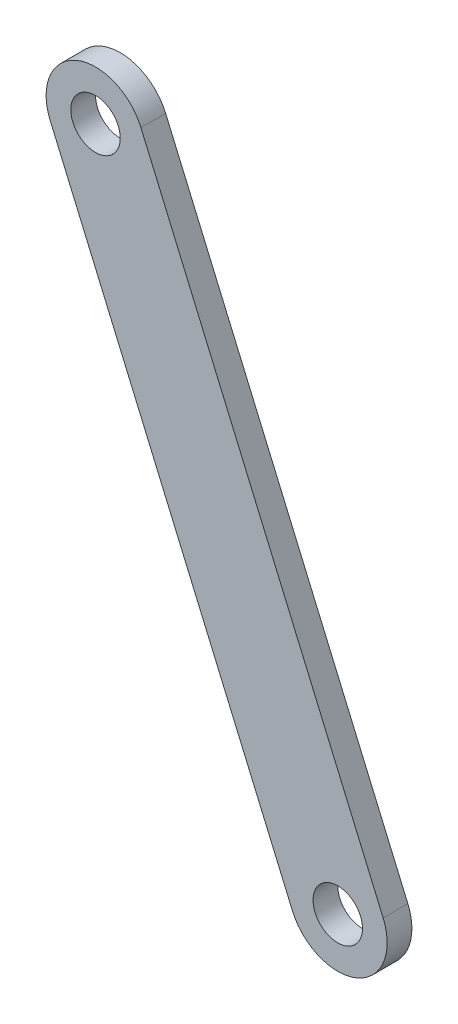
ISO-10303-21;
HEADER;
FILE_DESCRIPTION(('STEP AP214'),'2;1');
FILE_NAME('part.step','',(''),(''),'','','');
FILE_SCHEMA(('AUTOMOTIVE_DESIGN { 1 0 10303 214 1 1 1 1 }'));
ENDSEC;
DATA;
#1=APPLICATION_CONTEXT('core data for automotive mechanical design processes');
#2=APPLICATION_PROTOCOL_DEFINITION('international standard','automotive_design',2000,#1);
#3=PRODUCT_CONTEXT('',#1,'mechanical');
#4=PRODUCT('Part','Part','',(#3));
#5=PRODUCT_RELATED_PRODUCT_CATEGORY('part','',(#4));
#6=PRODUCT_DEFINITION_FORMATION('','',#4);
#7=PRODUCT_DEFINITION_CONTEXT('part definition',#1,'design');
#8=PRODUCT_DEFINITION('design','',#6,#7);
#9=PRODUCT_DEFINITION_SHAPE('','',#8);
#10=(LENGTH_UNIT() NAMED_UNIT(*) SI_UNIT(.MILLI.,.METRE.));
#11=(NAMED_UNIT(*) PLANE_ANGLE_UNIT() SI_UNIT($,.RADIAN.));
#12=(NAMED_UNIT(*) SI_UNIT($,.STERADIAN.) SOLID_ANGLE_UNIT());
#13=UNCERTAINTY_MEASURE_WITH_UNIT(LENGTH_MEASURE(1.E-05),#10,'distance_accuracy_value','');
#14=(GEOMETRIC_REPRESENTATION_CONTEXT(3) GLOBAL_UNCERTAINTY_ASSIGNED_CONTEXT((#13)) GLOBAL_UNIT_ASSIGNED_CONTEXT((#10,
#11,#12)) REPRESENTATION_CONTEXT('',''));
#15=CARTESIAN_POINT('',(0.,0.,0.));
#16=DIRECTION('',(0.,0.,1.));
#17=DIRECTION('',(1.,0.,0.));
#18=AXIS2_PLACEMENT_3D('',#15,#16,#17);
#19=CARTESIAN_POINT('',(-74.7943653809361,8.1431702058961,1.5875));
#20=DIRECTION('',(0.,0.,1.));
#21=DIRECTION('',(1.,0.,0.));
#22=AXIS2_PLACEMENT_3D('',#19,#20,#21);
#23=PLANE('',#22);
#24=CARTESIAN_POINT('',(-59.231514961415,-28.0529302307478,1.5875));
#25=DIRECTION('',(0.,0.,1.));
#26=DIRECTION('',(1.,0.,0.));
#27=AXIS2_PLACEMENT_3D('',#24,#25,#26);
#28=CIRCLE('',#27,1.5875);
#29=CARTESIAN_POINT('',(-57.644014961415,-28.0529302307478,1.5875));
#30=VERTEX_POINT('',#29);
#31=EDGE_CURVE('E101',#30,#30,#28,.T.);
#32=ORIENTED_EDGE('',*,*,#31,.F.);
#33=EDGE_LOOP('',(#32));
#34=FACE_BOUND('',#33,.T.);
#35=CARTESIAN_POINT('',(-74.7943653809361,8.1431702058961,1.5875));
#36=DIRECTION('',(0.,0.,1.));
#37=DIRECTION('',(1.,0.,0.));
#38=AXIS2_PLACEMENT_3D('',#35,#36,#37);
#39=CIRCLE('',#38,3.17500000000001);
#40=CARTESIAN_POINT('',(-71.877547642704,9.39728315213923,1.5875));
#41=VERTEX_POINT('',#40);
#42=CARTESIAN_POINT('',(-77.7111831191682,6.88905725965296,1.5875));
#43=VERTEX_POINT('',#42);
#44=EDGE_CURVE('E86',#41,#43,#39,.T.);
#45=ORIENTED_EDGE('',*,*,#44,.T.);
#46=DIRECTION('',(0.394996203541145,-0.918682752199083,0.));
#47=VECTOR('',#46,1.);
#48=CARTESIAN_POINT('',(-77.7111831191682,6.88905725965296,1.5875));
#49=LINE('',#48,#47);
#50=CARTESIAN_POINT('',(-62.148332699647,-29.3070431769909,1.5875));
#51=VERTEX_POINT('',#50);
#52=EDGE_CURVE('E81',#43,#51,#49,.T.);
#53=ORIENTED_EDGE('',*,*,#52,.T.);
#54=CARTESIAN_POINT('',(-59.231514961415,-28.0529302307478,1.5875));
#55=DIRECTION('',(0.,0.,1.));
#56=DIRECTION('',(1.,0.,0.));
#57=AXIS2_PLACEMENT_3D('',#54,#55,#56);
#58=CIRCLE('',#57,3.17499999999999);
#59=CARTESIAN_POINT('',(-56.3146972231829,-26.7988172845047,1.5875));
#60=VERTEX_POINT('',#59);
#61=EDGE_CURVE('E84',#51,#60,#58,.T.);
#62=ORIENTED_EDGE('',*,*,#61,.T.);
#63=DIRECTION('',(-0.394996203541144,0.918682752199084,0.));
#64=VECTOR('',#63,1.);
#65=CARTESIAN_POINT('',(-71.877547642704,9.39728315213923,1.5875));
#66=LINE('',#65,#64);
#67=EDGE_CURVE('E51',#60,#41,#66,.T.);
#68=ORIENTED_EDGE('',*,*,#67,.T.);
#69=EDGE_LOOP('',(#45,#53,#62,#68));
#70=FACE_BOUND('',#69,.T.);
#71=CARTESIAN_POINT('',(-74.7943653809361,8.1431702058961,1.5875));
#72=DIRECTION('',(0.,0.,1.));
#73=DIRECTION('',(1.,0.,0.));
#74=AXIS2_PLACEMENT_3D('',#71,#72,#73);
#75=CIRCLE('',#74,1.5875);
#76=CARTESIAN_POINT('',(-73.2068653809361,8.1431702058961,1.5875));
#77=VERTEX_POINT('',#76);
#78=EDGE_CURVE('E116',#77,#77,#75,.T.);
#79=ORIENTED_EDGE('',*,*,#78,.F.);
#80=EDGE_LOOP('',(#79));
#81=FACE_BOUND('',#80,.T.);
#82=ADVANCED_FACE('F34',(#34,#70,#81),#23,.T.);
#83=CARTESIAN_POINT('',(-74.7943653809361,8.1431702058961,0.));
#84=DIRECTION('',(0.,0.,1.));
#85=DIRECTION('',(1.,0.,0.));
#86=AXIS2_PLACEMENT_3D('',#83,#84,#85);
#87=PLANE('',#86);
#88=CARTESIAN_POINT('',(-59.231514961415,-28.0529302307478,0.));
#89=DIRECTION('',(0.,0.,1.));
#90=DIRECTION('',(1.,0.,0.));
#91=AXIS2_PLACEMENT_3D('',#88,#89,#90);
#92=CIRCLE('',#91,1.5875);
#93=CARTESIAN_POINT('',(-57.644014961415,-28.0529302307478,0.));
#94=VERTEX_POINT('',#93);
#95=EDGE_CURVE('E113',#94,#94,#92,.T.);
#96=ORIENTED_EDGE('',*,*,#95,.T.);
#97=EDGE_LOOP('',(#96));
#98=FACE_BOUND('',#97,.T.);
#99=CARTESIAN_POINT('',(-74.7943653809361,8.1431702058961,0.));
#100=DIRECTION('',(0.,0.,1.));
#101=DIRECTION('',(1.,0.,0.));
#102=AXIS2_PLACEMENT_3D('',#99,#100,#101);
#103=CIRCLE('',#102,3.17500000000001);
#104=CARTESIAN_POINT('',(-71.877547642704,9.39728315213923,0.));
#105=VERTEX_POINT('',#104);
#106=CARTESIAN_POINT('',(-77.7111831191682,6.88905725965296,0.));
#107=VERTEX_POINT('',#106);
#108=EDGE_CURVE('E98',#105,#107,#103,.T.);
#109=ORIENTED_EDGE('',*,*,#108,.F.);
#110=DIRECTION('',(-0.394996203541144,0.918682752199084,0.));
#111=VECTOR('',#110,1.);
#112=CARTESIAN_POINT('',(-71.877547642704,9.39728315213923,0.));
#113=LINE('',#112,#111);
#114=CARTESIAN_POINT('',(-56.3146972231829,-26.7988172845047,0.));
#115=VERTEX_POINT('',#114);
#116=EDGE_CURVE('E74',#115,#105,#113,.T.);
#117=ORIENTED_EDGE('',*,*,#116,.F.);
#118=CARTESIAN_POINT('',(-59.231514961415,-28.0529302307478,0.));
#119=DIRECTION('',(0.,0.,1.));
#120=DIRECTION('',(1.,0.,0.));
#121=AXIS2_PLACEMENT_3D('',#118,#119,#120);
#122=CIRCLE('',#121,3.17499999999999);
#123=CARTESIAN_POINT('',(-62.148332699647,-29.3070431769909,0.));
#124=VERTEX_POINT('',#123);
#125=EDGE_CURVE('E68',#124,#115,#122,.T.);
#126=ORIENTED_EDGE('',*,*,#125,.F.);
#127=DIRECTION('',(0.394996203541145,-0.918682752199083,0.));
#128=VECTOR('',#127,1.);
#129=CARTESIAN_POINT('',(-77.7111831191682,6.88905725965296,0.));
#130=LINE('',#129,#128);
#131=EDGE_CURVE('E90',#107,#124,#130,.T.);
#132=ORIENTED_EDGE('',*,*,#131,.F.);
#133=EDGE_LOOP('',(#109,#117,#126,#132));
#134=FACE_BOUND('',#133,.T.);
#135=CARTESIAN_POINT('',(-74.7943653809361,8.1431702058961,0.));
#136=DIRECTION('',(0.,0.,1.));
#137=DIRECTION('',(1.,0.,0.));
#138=AXIS2_PLACEMENT_3D('',#135,#136,#137);
#139=CIRCLE('',#138,1.5875);
#140=CARTESIAN_POINT('',(-73.2068653809361,8.1431702058961,0.));
#141=VERTEX_POINT('',#140);
#142=EDGE_CURVE('E119',#141,#141,#139,.T.);
#143=ORIENTED_EDGE('',*,*,#142,.T.);
#144=EDGE_LOOP('',(#143));
#145=FACE_BOUND('',#144,.T.);
#146=ADVANCED_FACE('F109',(#98,#134,#145),#87,.F.);
#147=CARTESIAN_POINT('',(-74.7943653809361,8.1431702058961,1.5875));
#148=DIRECTION('',(0.,0.,-1.));
#149=DIRECTION('',(-1.,0.,0.));
#150=AXIS2_PLACEMENT_3D('',#147,#148,#149);
#151=CYLINDRICAL_SURFACE('',#150,3.17500000000001);
#152=ORIENTED_EDGE('',*,*,#108,.T.);
#153=DIRECTION('',(0.,0.,-1.));
#154=VECTOR('',#153,1.);
#155=CARTESIAN_POINT('',(-77.7111831191682,6.88905725965296,1.5875));
#156=LINE('',#155,#154);
#157=EDGE_CURVE('E11',#43,#107,#156,.T.);
#158=ORIENTED_EDGE('',*,*,#157,.F.);
#159=ORIENTED_EDGE('',*,*,#44,.F.);
#160=DIRECTION('',(0.,0.,-1.));
#161=VECTOR('',#160,1.);
#162=CARTESIAN_POINT('',(-71.877547642704,9.39728315213923,1.5875));
#163=LINE('',#162,#161);
#164=EDGE_CURVE('E94',#41,#105,#163,.T.);
#165=ORIENTED_EDGE('',*,*,#164,.T.);
#166=EDGE_LOOP('',(#152,#158,#159,#165));
#167=FACE_BOUND('',#166,.T.);
#168=ADVANCED_FACE('F36',(#167),#151,.T.);
#169=CARTESIAN_POINT('',(-77.7111831191682,6.88905725965296,1.5875));
#170=DIRECTION('',(0.918682752199083,0.394996203541145,0.));
#171=DIRECTION('',(-0.394996203541145,0.918682752199083,0.));
#172=AXIS2_PLACEMENT_3D('',#169,#170,#171);
#173=PLANE('',#172);
#174=ORIENTED_EDGE('',*,*,#131,.T.);
#175=DIRECTION('',(0.,0.,-1.));
#176=VECTOR('',#175,1.);
#177=CARTESIAN_POINT('',(-62.148332699647,-29.3070431769909,1.5875));
#178=LINE('',#177,#176);
#179=EDGE_CURVE('E43',#51,#124,#178,.T.);
#180=ORIENTED_EDGE('',*,*,#179,.F.);
#181=ORIENTED_EDGE('',*,*,#52,.F.);
#182=ORIENTED_EDGE('',*,*,#157,.T.);
#183=EDGE_LOOP('',(#174,#180,#181,#182));
#184=FACE_BOUND('',#183,.T.);
#185=ADVANCED_FACE('F89',(#184),#173,.F.);
#186=CARTESIAN_POINT('',(-59.231514961415,-28.0529302307478,1.5875));
#187=DIRECTION('',(0.,0.,-1.));
#188=DIRECTION('',(-1.,0.,0.));
#189=AXIS2_PLACEMENT_3D('',#186,#187,#188);
#190=CYLINDRICAL_SURFACE('',#189,3.17499999999999);
#191=ORIENTED_EDGE('',*,*,#125,.T.);
#192=DIRECTION('',(0.,0.,-1.));
#193=VECTOR('',#192,1.);
#194=CARTESIAN_POINT('',(-56.3146972231829,-26.7988172845047,1.5875));
#195=LINE('',#194,#193);
#196=EDGE_CURVE('E91',#60,#115,#195,.T.);
#197=ORIENTED_EDGE('',*,*,#196,.F.);
#198=ORIENTED_EDGE('',*,*,#61,.F.);
#199=ORIENTED_EDGE('',*,*,#179,.T.);
#200=EDGE_LOOP('',(#191,#197,#198,#199));
#201=FACE_BOUND('',#200,.T.);
#202=ADVANCED_FACE('F92',(#201),#190,.T.);
#203=CARTESIAN_POINT('',(-71.877547642704,9.39728315213923,1.5875));
#204=DIRECTION('',(-0.918682752199084,-0.394996203541144,0.));
#205=DIRECTION('',(0.394996203541144,-0.918682752199084,0.));
#206=AXIS2_PLACEMENT_3D('',#203,#204,#205);
#207=PLANE('',#206);
#208=ORIENTED_EDGE('',*,*,#116,.T.);
#209=ORIENTED_EDGE('',*,*,#164,.F.);
#210=ORIENTED_EDGE('',*,*,#67,.F.);
#211=ORIENTED_EDGE('',*,*,#196,.T.);
#212=EDGE_LOOP('',(#208,#209,#210,#211));
#213=FACE_BOUND('',#212,.T.);
#214=ADVANCED_FACE('F106',(#213),#207,.F.);
#215=CARTESIAN_POINT('',(-59.231514961415,-28.0529302307478,1.5875));
#216=DIRECTION('',(0.,0.,-1.));
#217=DIRECTION('',(-1.,0.,0.));
#218=AXIS2_PLACEMENT_3D('',#215,#216,#217);
#219=CYLINDRICAL_SURFACE('',#218,1.5875);
#220=ORIENTED_EDGE('',*,*,#31,.T.);
#221=EDGE_LOOP('',(#220));
#222=FACE_BOUND('',#221,.T.);
#223=ORIENTED_EDGE('',*,*,#95,.F.);
#224=EDGE_LOOP('',(#223));
#225=FACE_BOUND('',#224,.T.);
#226=ADVANCED_FACE('F137',(#222,#225),#219,.F.);
#227=CARTESIAN_POINT('',(-74.7943653809361,8.1431702058961,1.5875));
#228=DIRECTION('',(0.,0.,-1.));
#229=DIRECTION('',(-1.,0.,0.));
#230=AXIS2_PLACEMENT_3D('',#227,#228,#229);
#231=CYLINDRICAL_SURFACE('',#230,1.5875);
#232=ORIENTED_EDGE('',*,*,#78,.T.);
#233=EDGE_LOOP('',(#232));
#234=FACE_BOUND('',#233,.T.);
#235=ORIENTED_EDGE('',*,*,#142,.F.);
#236=EDGE_LOOP('',(#235));
#237=FACE_BOUND('',#236,.T.);
#238=ADVANCED_FACE('F125',(#234,#237),#231,.F.);
#239=CLOSED_SHELL('',(#82,#146,#168,#185,#202,#214,#226,#238));
#240=MANIFOLD_SOLID_BREP('B2',#239);
#241=ADVANCED_BREP_SHAPE_REPRESENTATION('',(#18,#240),#14);
#242=SHAPE_DEFINITION_REPRESENTATION(#9,#241);
ENDSEC;
END-ISO-10303-21;
